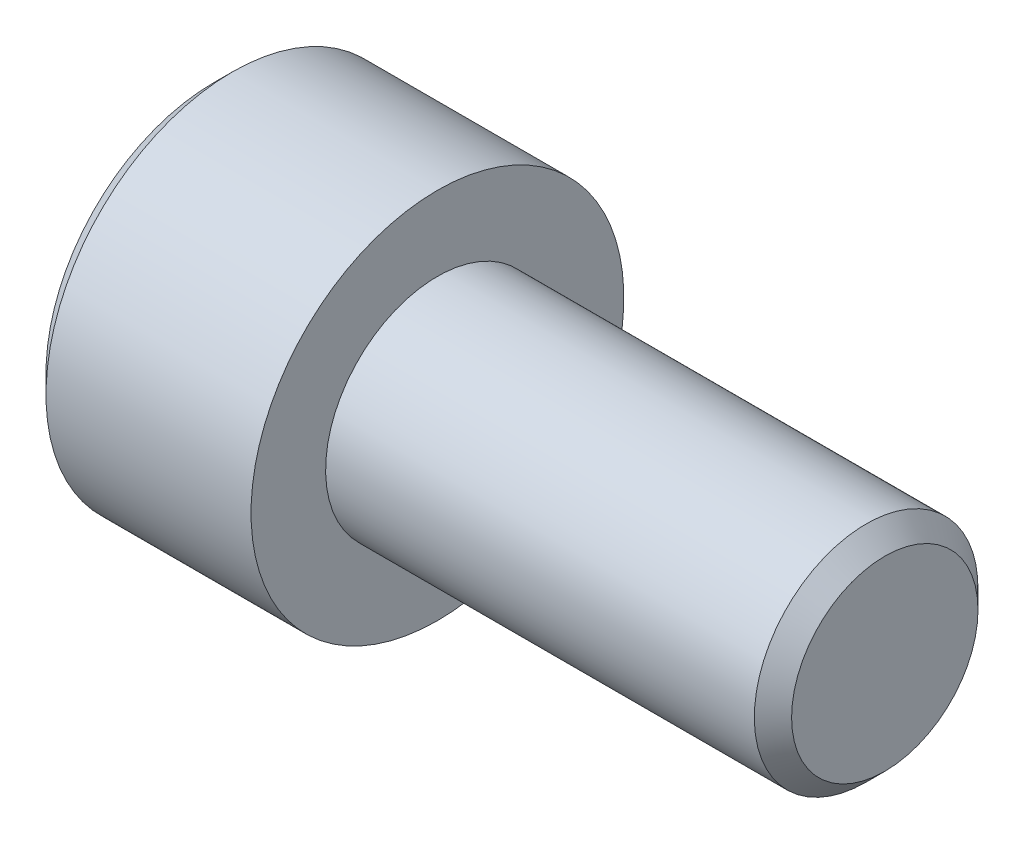
ISO-10303-21;
HEADER;
FILE_DESCRIPTION(('STEP AP214'),'2;1');
FILE_NAME('part.step','',(''),(''),'','','');
FILE_SCHEMA(('AUTOMOTIVE_DESIGN { 1 0 10303 214 1 1 1 1 }'));
ENDSEC;
DATA;
#1=APPLICATION_CONTEXT('core data for automotive mechanical design processes');
#2=APPLICATION_PROTOCOL_DEFINITION('international standard','automotive_design',2000,#1);
#3=PRODUCT_CONTEXT('',#1,'mechanical');
#4=PRODUCT('Part','Part','',(#3));
#5=PRODUCT_RELATED_PRODUCT_CATEGORY('part','',(#4));
#6=PRODUCT_DEFINITION_FORMATION('','',#4);
#7=PRODUCT_DEFINITION_CONTEXT('part definition',#1,'design');
#8=PRODUCT_DEFINITION('design','',#6,#7);
#9=PRODUCT_DEFINITION_SHAPE('','',#8);
#10=(LENGTH_UNIT() NAMED_UNIT(*) SI_UNIT(.MILLI.,.METRE.));
#11=(NAMED_UNIT(*) PLANE_ANGLE_UNIT() SI_UNIT($,.RADIAN.));
#12=(NAMED_UNIT(*) SI_UNIT($,.STERADIAN.) SOLID_ANGLE_UNIT());
#13=UNCERTAINTY_MEASURE_WITH_UNIT(LENGTH_MEASURE(1.E-05),#10,'distance_accuracy_value','');
#14=(GEOMETRIC_REPRESENTATION_CONTEXT(3) GLOBAL_UNCERTAINTY_ASSIGNED_CONTEXT((#13)) GLOBAL_UNIT_ASSIGNED_CONTEXT((#10,
#11,#12)) REPRESENTATION_CONTEXT('',''));
#15=CARTESIAN_POINT('',(0.,0.,0.));
#16=DIRECTION('',(0.,0.,1.));
#17=DIRECTION('',(1.,0.,0.));
#18=AXIS2_PLACEMENT_3D('',#15,#16,#17);
#19=CARTESIAN_POINT('',(-6.,0.,0.));
#20=DIRECTION('',(1.,0.,0.));
#21=DIRECTION('',(0.,1.,0.));
#22=AXIS2_PLACEMENT_3D('',#19,#20,#21);
#23=PLANE('',#22);
#24=CARTESIAN_POINT('',(-6.,0.,0.));
#25=DIRECTION('',(1.,0.,0.));
#26=DIRECTION('',(0.,1.,0.));
#27=AXIS2_PLACEMENT_3D('',#24,#25,#26);
#28=CIRCLE('',#27,4.5);
#29=CARTESIAN_POINT('',(-6.,4.5,0.));
#30=VERTEX_POINT('',#29);
#31=EDGE_CURVE('E40',#30,#30,#28,.F.);
#32=ORIENTED_EDGE('',*,*,#31,.T.);
#33=EDGE_LOOP('',(#32));
#34=FACE_BOUND('',#33,.T.);
#35=DIRECTION('',(0.,-0.5,-0.866025403784439));
#36=VECTOR('',#35,1.);
#37=CARTESIAN_POINT('',(-6.,2.88675134594813,0.));
#38=LINE('',#37,#36);
#39=CARTESIAN_POINT('',(-6.,2.88675134594813,0.));
#40=VERTEX_POINT('',#39);
#41=CARTESIAN_POINT('',(-6.,1.44337567297407,-2.5));
#42=VERTEX_POINT('',#41);
#43=EDGE_CURVE('E120',#40,#42,#38,.T.);
#44=ORIENTED_EDGE('',*,*,#43,.F.);
#45=DIRECTION('',(0.,0.5,-0.866025403784439));
#46=VECTOR('',#45,1.);
#47=CARTESIAN_POINT('',(-6.,1.44337567297407,2.5));
#48=LINE('',#47,#46);
#49=CARTESIAN_POINT('',(-6.,1.44337567297407,2.5));
#50=VERTEX_POINT('',#49);
#51=EDGE_CURVE('E47',#50,#40,#48,.T.);
#52=ORIENTED_EDGE('',*,*,#51,.F.);
#53=DIRECTION('',(0.,1.,0.));
#54=VECTOR('',#53,1.);
#55=CARTESIAN_POINT('',(-6.,-1.44337567297406,2.5));
#56=LINE('',#55,#54);
#57=CARTESIAN_POINT('',(-6.,-1.44337567297406,2.5));
#58=VERTEX_POINT('',#57);
#59=EDGE_CURVE('E106',#58,#50,#56,.T.);
#60=ORIENTED_EDGE('',*,*,#59,.F.);
#61=DIRECTION('',(0.,0.5,0.866025403784439));
#62=VECTOR('',#61,1.);
#63=CARTESIAN_POINT('',(-6.,-2.88675134594813,0.));
#64=LINE('',#63,#62);
#65=CARTESIAN_POINT('',(-6.,-2.88675134594813,0.));
#66=VERTEX_POINT('',#65);
#67=EDGE_CURVE('E109',#66,#58,#64,.T.);
#68=ORIENTED_EDGE('',*,*,#67,.F.);
#69=DIRECTION('',(0.,-0.5,0.866025403784439));
#70=VECTOR('',#69,1.);
#71=CARTESIAN_POINT('',(-6.,-1.44337567297406,-2.5));
#72=LINE('',#71,#70);
#73=CARTESIAN_POINT('',(-6.,-1.44337567297406,-2.5));
#74=VERTEX_POINT('',#73);
#75=EDGE_CURVE('E125',#74,#66,#72,.T.);
#76=ORIENTED_EDGE('',*,*,#75,.F.);
#77=DIRECTION('',(0.,-1.,0.));
#78=VECTOR('',#77,1.);
#79=CARTESIAN_POINT('',(-6.,1.44337567297407,-2.5));
#80=LINE('',#79,#78);
#81=EDGE_CURVE('E122',#42,#74,#80,.T.);
#82=ORIENTED_EDGE('',*,*,#81,.F.);
#83=EDGE_LOOP('',(#44,#52,#60,#68,#76,#82));
#84=FACE_BOUND('',#83,.T.);
#85=ADVANCED_FACE('F32',(#34,#84),#23,.F.);
#86=CARTESIAN_POINT('',(12.,0.,0.));
#87=DIRECTION('',(-1.,0.,0.));
#88=DIRECTION('',(0.,-1.,0.));
#89=AXIS2_PLACEMENT_3D('',#86,#87,#88);
#90=CYLINDRICAL_SURFACE('',#89,5.);
#91=CARTESIAN_POINT('',(-5.5,0.,0.));
#92=DIRECTION('',(1.,0.,0.));
#93=DIRECTION('',(0.,1.,0.));
#94=AXIS2_PLACEMENT_3D('',#91,#92,#93);
#95=CIRCLE('',#94,5.);
#96=CARTESIAN_POINT('',(-5.5,5.,0.));
#97=VERTEX_POINT('',#96);
#98=EDGE_CURVE('E11',#97,#97,#95,.T.);
#99=ORIENTED_EDGE('',*,*,#98,.T.);
#100=EDGE_LOOP('',(#99));
#101=FACE_BOUND('',#100,.T.);
#102=CARTESIAN_POINT('',(0.,0.,0.));
#103=DIRECTION('',(-1.,0.,0.));
#104=DIRECTION('',(0.,-1.,0.));
#105=AXIS2_PLACEMENT_3D('',#102,#103,#104);
#106=CIRCLE('',#105,5.);
#107=CARTESIAN_POINT('',(0.,-5.,0.));
#108=VERTEX_POINT('',#107);
#109=EDGE_CURVE('E145',#108,#108,#106,.T.);
#110=ORIENTED_EDGE('',*,*,#109,.T.);
#111=EDGE_LOOP('',(#110));
#112=FACE_BOUND('',#111,.T.);
#113=ADVANCED_FACE('F168',(#101,#112),#90,.T.);
#114=CARTESIAN_POINT('',(0.,5.,0.));
#115=DIRECTION('',(-1.,0.,0.));
#116=DIRECTION('',(0.,-1.,0.));
#117=AXIS2_PLACEMENT_3D('',#114,#115,#116);
#118=PLANE('',#117);
#119=ORIENTED_EDGE('',*,*,#109,.F.);
#120=EDGE_LOOP('',(#119));
#121=FACE_BOUND('',#120,.T.);
#122=CARTESIAN_POINT('',(0.,0.,0.));
#123=DIRECTION('',(-1.,0.,0.));
#124=DIRECTION('',(0.,-1.,0.));
#125=AXIS2_PLACEMENT_3D('',#122,#123,#124);
#126=CIRCLE('',#125,3.);
#127=CARTESIAN_POINT('',(0.,-3.,0.));
#128=VERTEX_POINT('',#127);
#129=EDGE_CURVE('E142',#128,#128,#126,.T.);
#130=ORIENTED_EDGE('',*,*,#129,.T.);
#131=EDGE_LOOP('',(#130));
#132=FACE_BOUND('',#131,.T.);
#133=ADVANCED_FACE('F173',(#121,#132),#118,.F.);
#134=CARTESIAN_POINT('',(12.,0.,0.));
#135=DIRECTION('',(-1.,0.,0.));
#136=DIRECTION('',(0.,-1.,0.));
#137=AXIS2_PLACEMENT_3D('',#134,#135,#136);
#138=CYLINDRICAL_SURFACE('',#137,3.);
#139=CARTESIAN_POINT('',(11.5,0.,0.));
#140=DIRECTION('',(-1.,0.,0.));
#141=DIRECTION('',(0.,-1.,0.));
#142=AXIS2_PLACEMENT_3D('',#139,#140,#141);
#143=CIRCLE('',#142,3.);
#144=CARTESIAN_POINT('',(11.5,-3.,0.));
#145=VERTEX_POINT('',#144);
#146=EDGE_CURVE('E148',#145,#145,#143,.T.);
#147=ORIENTED_EDGE('',*,*,#146,.T.);
#148=EDGE_LOOP('',(#147));
#149=FACE_BOUND('',#148,.T.);
#150=ORIENTED_EDGE('',*,*,#129,.F.);
#151=EDGE_LOOP('',(#150));
#152=FACE_BOUND('',#151,.T.);
#153=ADVANCED_FACE('F179',(#149,#152),#138,.T.);
#154=CARTESIAN_POINT('',(12.,3.,0.));
#155=DIRECTION('',(-1.,0.,0.));
#156=DIRECTION('',(0.,-1.,0.));
#157=AXIS2_PLACEMENT_3D('',#154,#155,#156);
#158=PLANE('',#157);
#159=CARTESIAN_POINT('',(12.,0.,0.));
#160=DIRECTION('',(-1.,0.,0.));
#161=DIRECTION('',(0.,-1.,0.));
#162=AXIS2_PLACEMENT_3D('',#159,#160,#161);
#163=CIRCLE('',#162,2.5);
#164=CARTESIAN_POINT('',(12.,-2.5,0.));
#165=VERTEX_POINT('',#164);
#166=EDGE_CURVE('E151',#165,#165,#163,.F.);
#167=ORIENTED_EDGE('',*,*,#166,.T.);
#168=EDGE_LOOP('',(#167));
#169=FACE_BOUND('',#168,.T.);
#170=ADVANCED_FACE('F183',(#169),#158,.F.);
#171=CARTESIAN_POINT('',(-3.,1.44337567297407,2.5));
#172=DIRECTION('',(0.,0.866025403784439,0.5));
#173=DIRECTION('',(0.,-0.5,0.866025403784439));
#174=AXIS2_PLACEMENT_3D('',#171,#172,#173);
#175=PLANE('',#174);
#176=ORIENTED_EDGE('',*,*,#51,.T.);
#177=DIRECTION('',(-1.,0.,0.));
#178=VECTOR('',#177,1.);
#179=CARTESIAN_POINT('',(-3.,2.88675134594813,0.));
#180=LINE('',#179,#178);
#181=CARTESIAN_POINT('',(-3.,2.88675134594813,0.));
#182=VERTEX_POINT('',#181);
#183=EDGE_CURVE('E83',#182,#40,#180,.T.);
#184=ORIENTED_EDGE('',*,*,#183,.F.);
#185=DIRECTION('',(0.,0.5,-0.866025403784439));
#186=VECTOR('',#185,1.);
#187=CARTESIAN_POINT('',(-3.,1.44337567297407,2.5));
#188=LINE('',#187,#186);
#189=CARTESIAN_POINT('',(-3.,1.44337567297407,2.5));
#190=VERTEX_POINT('',#189);
#191=EDGE_CURVE('E87',#190,#182,#188,.T.);
#192=ORIENTED_EDGE('',*,*,#191,.F.);
#193=DIRECTION('',(-1.,0.,0.));
#194=VECTOR('',#193,1.);
#195=CARTESIAN_POINT('',(-3.,1.44337567297407,2.5));
#196=LINE('',#195,#194);
#197=EDGE_CURVE('E130',#190,#50,#196,.T.);
#198=ORIENTED_EDGE('',*,*,#197,.T.);
#199=EDGE_LOOP('',(#176,#184,#192,#198));
#200=FACE_BOUND('',#199,.T.);
#201=ADVANCED_FACE('F85',(#200),#175,.F.);
#202=CARTESIAN_POINT('',(-3.,-1.44337567297406,2.5));
#203=DIRECTION('',(0.,0.,1.));
#204=DIRECTION('',(0.,-1.,0.));
#205=AXIS2_PLACEMENT_3D('',#202,#203,#204);
#206=PLANE('',#205);
#207=ORIENTED_EDGE('',*,*,#59,.T.);
#208=ORIENTED_EDGE('',*,*,#197,.F.);
#209=DIRECTION('',(0.,1.,0.));
#210=VECTOR('',#209,1.);
#211=CARTESIAN_POINT('',(-3.,-1.44337567297406,2.5));
#212=LINE('',#211,#210);
#213=CARTESIAN_POINT('',(-3.,-1.44337567297406,2.5));
#214=VERTEX_POINT('',#213);
#215=EDGE_CURVE('E93',#214,#190,#212,.T.);
#216=ORIENTED_EDGE('',*,*,#215,.F.);
#217=DIRECTION('',(-1.,0.,0.));
#218=VECTOR('',#217,1.);
#219=CARTESIAN_POINT('',(-3.,-1.44337567297406,2.5));
#220=LINE('',#219,#218);
#221=EDGE_CURVE('E133',#214,#58,#220,.T.);
#222=ORIENTED_EDGE('',*,*,#221,.T.);
#223=EDGE_LOOP('',(#207,#208,#216,#222));
#224=FACE_BOUND('',#223,.T.);
#225=ADVANCED_FACE('F193',(#224),#206,.F.);
#226=CARTESIAN_POINT('',(-3.,-2.88675134594813,0.));
#227=DIRECTION('',(0.,-0.866025403784439,0.5));
#228=DIRECTION('',(0.,-0.5,-0.866025403784439));
#229=AXIS2_PLACEMENT_3D('',#226,#227,#228);
#230=PLANE('',#229);
#231=ORIENTED_EDGE('',*,*,#67,.T.);
#232=ORIENTED_EDGE('',*,*,#221,.F.);
#233=DIRECTION('',(0.,0.5,0.866025403784439));
#234=VECTOR('',#233,1.);
#235=CARTESIAN_POINT('',(-3.,-2.88675134594813,0.));
#236=LINE('',#235,#234);
#237=CARTESIAN_POINT('',(-3.,-2.88675134594813,0.));
#238=VERTEX_POINT('',#237);
#239=EDGE_CURVE('E116',#238,#214,#236,.T.);
#240=ORIENTED_EDGE('',*,*,#239,.F.);
#241=DIRECTION('',(-1.,0.,0.));
#242=VECTOR('',#241,1.);
#243=CARTESIAN_POINT('',(-3.,-2.88675134594813,0.));
#244=LINE('',#243,#242);
#245=EDGE_CURVE('E135',#238,#66,#244,.T.);
#246=ORIENTED_EDGE('',*,*,#245,.T.);
#247=EDGE_LOOP('',(#231,#232,#240,#246));
#248=FACE_BOUND('',#247,.T.);
#249=ADVANCED_FACE('F203',(#248),#230,.F.);
#250=CARTESIAN_POINT('',(-3.,-1.44337567297406,-2.5));
#251=DIRECTION('',(0.,-0.866025403784438,-0.5));
#252=DIRECTION('',(0.,0.5,-0.866025403784439));
#253=AXIS2_PLACEMENT_3D('',#250,#251,#252);
#254=PLANE('',#253);
#255=ORIENTED_EDGE('',*,*,#75,.T.);
#256=ORIENTED_EDGE('',*,*,#245,.F.);
#257=DIRECTION('',(0.,-0.5,0.866025403784439));
#258=VECTOR('',#257,1.);
#259=CARTESIAN_POINT('',(-3.,-1.44337567297406,-2.5));
#260=LINE('',#259,#258);
#261=CARTESIAN_POINT('',(-3.,-1.44337567297406,-2.5));
#262=VERTEX_POINT('',#261);
#263=EDGE_CURVE('E113',#262,#238,#260,.T.);
#264=ORIENTED_EDGE('',*,*,#263,.F.);
#265=DIRECTION('',(-1.,0.,0.));
#266=VECTOR('',#265,1.);
#267=CARTESIAN_POINT('',(-3.,-1.44337567297406,-2.5));
#268=LINE('',#267,#266);
#269=EDGE_CURVE('E137',#262,#74,#268,.T.);
#270=ORIENTED_EDGE('',*,*,#269,.T.);
#271=EDGE_LOOP('',(#255,#256,#264,#270));
#272=FACE_BOUND('',#271,.T.);
#273=ADVANCED_FACE('F199',(#272),#254,.F.);
#274=CARTESIAN_POINT('',(-3.,1.44337567297407,-2.5));
#275=DIRECTION('',(0.,0.,-1.));
#276=DIRECTION('',(-1.,0.,0.));
#277=AXIS2_PLACEMENT_3D('',#274,#275,#276);
#278=PLANE('',#277);
#279=ORIENTED_EDGE('',*,*,#81,.T.);
#280=ORIENTED_EDGE('',*,*,#269,.F.);
#281=DIRECTION('',(0.,-1.,0.));
#282=VECTOR('',#281,1.);
#283=CARTESIAN_POINT('',(-3.,1.44337567297407,-2.5));
#284=LINE('',#283,#282);
#285=CARTESIAN_POINT('',(-3.,1.44337567297407,-2.5));
#286=VERTEX_POINT('',#285);
#287=EDGE_CURVE('E101',#286,#262,#284,.T.);
#288=ORIENTED_EDGE('',*,*,#287,.F.);
#289=DIRECTION('',(-1.,0.,0.));
#290=VECTOR('',#289,1.);
#291=CARTESIAN_POINT('',(-3.,1.44337567297407,-2.5));
#292=LINE('',#291,#290);
#293=EDGE_CURVE('E92',#286,#42,#292,.T.);
#294=ORIENTED_EDGE('',*,*,#293,.T.);
#295=EDGE_LOOP('',(#279,#280,#288,#294));
#296=FACE_BOUND('',#295,.T.);
#297=ADVANCED_FACE('F196',(#296),#278,.F.);
#298=CARTESIAN_POINT('',(-3.,2.88675134594813,0.));
#299=DIRECTION('',(0.,0.866025403784439,-0.5));
#300=DIRECTION('',(0.,0.5,0.866025403784439));
#301=AXIS2_PLACEMENT_3D('',#298,#299,#300);
#302=PLANE('',#301);
#303=ORIENTED_EDGE('',*,*,#43,.T.);
#304=ORIENTED_EDGE('',*,*,#293,.F.);
#305=DIRECTION('',(0.,-0.5,-0.866025403784439));
#306=VECTOR('',#305,1.);
#307=CARTESIAN_POINT('',(-3.,2.88675134594813,0.));
#308=LINE('',#307,#306);
#309=EDGE_CURVE('E96',#182,#286,#308,.T.);
#310=ORIENTED_EDGE('',*,*,#309,.F.);
#311=ORIENTED_EDGE('',*,*,#183,.T.);
#312=EDGE_LOOP('',(#303,#304,#310,#311));
#313=FACE_BOUND('',#312,.T.);
#314=ADVANCED_FACE('F97',(#313),#302,.F.);
#315=CARTESIAN_POINT('',(-3.,2.88675134594813,0.));
#316=DIRECTION('',(-1.,0.,0.));
#317=DIRECTION('',(0.,0.,1.));
#318=AXIS2_PLACEMENT_3D('',#315,#316,#317);
#319=PLANE('',#318);
#320=CARTESIAN_POINT('',(-3.,0.,0.));
#321=DIRECTION('',(-1.,0.,0.));
#322=DIRECTION('',(0.,0.,1.));
#323=AXIS2_PLACEMENT_3D('',#320,#321,#322);
#324=CIRCLE('',#323,2.495);
#325=CARTESIAN_POINT('',(-3.,0.,2.495));
#326=VERTEX_POINT('',#325);
#327=EDGE_CURVE('E132',#326,#326,#324,.T.);
#328=ORIENTED_EDGE('',*,*,#327,.F.);
#329=EDGE_LOOP('',(#328));
#330=FACE_BOUND('',#329,.T.);
#331=ORIENTED_EDGE('',*,*,#191,.T.);
#332=ORIENTED_EDGE('',*,*,#309,.T.);
#333=ORIENTED_EDGE('',*,*,#287,.T.);
#334=ORIENTED_EDGE('',*,*,#263,.T.);
#335=ORIENTED_EDGE('',*,*,#239,.T.);
#336=ORIENTED_EDGE('',*,*,#215,.T.);
#337=EDGE_LOOP('',(#331,#332,#333,#334,#335,#336));
#338=FACE_BOUND('',#337,.T.);
#339=ADVANCED_FACE('F103',(#330,#338),#319,.T.);
#340=CARTESIAN_POINT('',(-2.33146676488434,0.,0.));
#341=DIRECTION('',(-1.,0.,0.));
#342=DIRECTION('',(0.,0.,1.));
#343=AXIS2_PLACEMENT_3D('',#340,#341,#342);
#344=CONICAL_SURFACE('',#343,0.,1.30899693899574);
#345=ORIENTED_EDGE('',*,*,#327,.T.);
#346=EDGE_LOOP('',(#345));
#347=FACE_BOUND('',#346,.T.);
#348=CARTESIAN_POINT('',(-2.33146676488434,0.,0.));
#349=VERTEX_POINT('',#348);
#350=VERTEX_LOOP('',#349);
#351=FACE_BOUND('',#350,.T.);
#352=ADVANCED_FACE('F164',(#347,#351),#344,.F.);
#353=CARTESIAN_POINT('',(11.5,0.,0.));
#354=DIRECTION('',(-1.,0.,0.));
#355=DIRECTION('',(0.,-1.,0.));
#356=AXIS2_PLACEMENT_3D('',#353,#354,#355);
#357=CONICAL_SURFACE('',#356,3.,0.785398163397448);
#358=ORIENTED_EDGE('',*,*,#166,.F.);
#359=EDGE_LOOP('',(#358));
#360=FACE_BOUND('',#359,.T.);
#361=ORIENTED_EDGE('',*,*,#146,.F.);
#362=EDGE_LOOP('',(#361));
#363=FACE_BOUND('',#362,.T.);
#364=ADVANCED_FACE('F159',(#360,#363),#357,.T.);
#365=CARTESIAN_POINT('',(-6.,0.,0.));
#366=DIRECTION('',(1.,0.,0.));
#367=DIRECTION('',(0.,1.,0.));
#368=AXIS2_PLACEMENT_3D('',#365,#366,#367);
#369=CONICAL_SURFACE('',#368,4.5,0.785398163397445);
#370=ORIENTED_EDGE('',*,*,#98,.F.);
#371=EDGE_LOOP('',(#370));
#372=FACE_BOUND('',#371,.T.);
#373=ORIENTED_EDGE('',*,*,#31,.F.);
#374=EDGE_LOOP('',(#373));
#375=FACE_BOUND('',#374,.T.);
#376=ADVANCED_FACE('F34',(#372,#375),#369,.T.);
#377=CLOSED_SHELL('',(#85,#113,#133,#153,#170,#201,#225,#249,#273,#297,#314,#339,#352,#364,#376));
#378=MANIFOLD_SOLID_BREP('B2',#377);
#379=ADVANCED_BREP_SHAPE_REPRESENTATION('',(#18,#378),#14);
#380=SHAPE_DEFINITION_REPRESENTATION(#9,#379);
ENDSEC;
END-ISO-10303-21;
